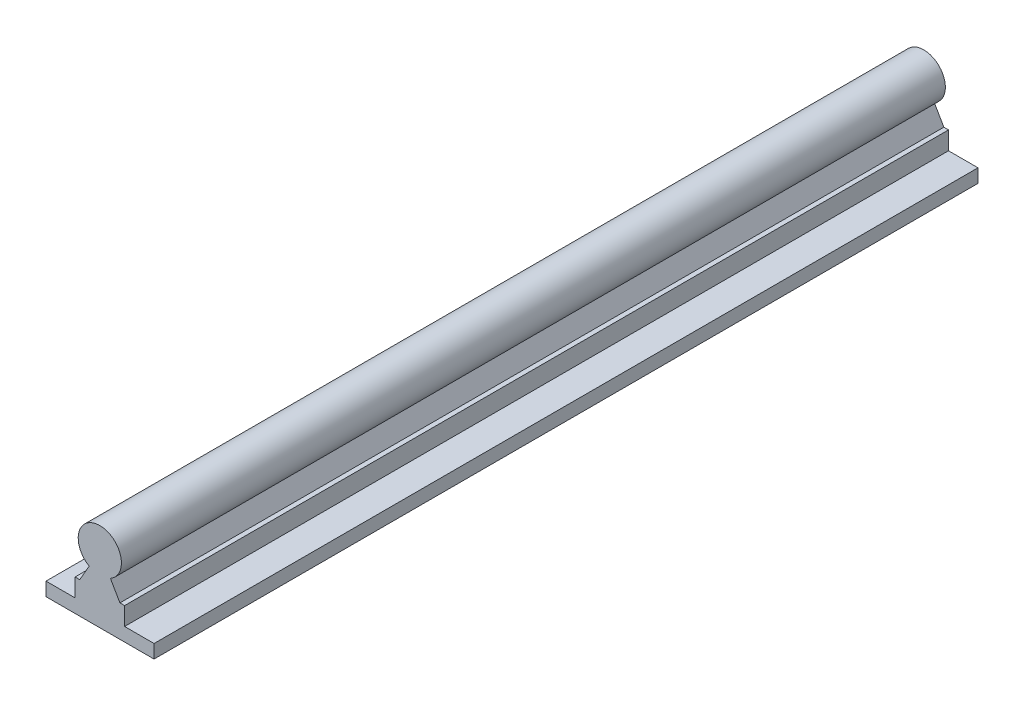
ISO-10303-21;
HEADER;
FILE_DESCRIPTION(('STEP AP214'),'2;1');
FILE_NAME('part.step','',(''),(''),'','','');
FILE_SCHEMA(('AUTOMOTIVE_DESIGN { 1 0 10303 214 1 1 1 1 }'));
ENDSEC;
DATA;
#1=APPLICATION_CONTEXT('core data for automotive mechanical design processes');
#2=APPLICATION_PROTOCOL_DEFINITION('international standard','automotive_design',2000,#1);
#3=PRODUCT_CONTEXT('',#1,'mechanical');
#4=PRODUCT('Part','Part','',(#3));
#5=PRODUCT_RELATED_PRODUCT_CATEGORY('part','',(#4));
#6=PRODUCT_DEFINITION_FORMATION('','',#4);
#7=PRODUCT_DEFINITION_CONTEXT('part definition',#1,'design');
#8=PRODUCT_DEFINITION('design','',#6,#7);
#9=PRODUCT_DEFINITION_SHAPE('','',#8);
#10=(LENGTH_UNIT() NAMED_UNIT(*) SI_UNIT(.MILLI.,.METRE.));
#11=(NAMED_UNIT(*) PLANE_ANGLE_UNIT() SI_UNIT($,.RADIAN.));
#12=(NAMED_UNIT(*) SI_UNIT($,.STERADIAN.) SOLID_ANGLE_UNIT());
#13=UNCERTAINTY_MEASURE_WITH_UNIT(LENGTH_MEASURE(1.E-05),#10,'distance_accuracy_value','');
#14=(GEOMETRIC_REPRESENTATION_CONTEXT(3) GLOBAL_UNCERTAINTY_ASSIGNED_CONTEXT((#13)) GLOBAL_UNIT_ASSIGNED_CONTEXT((#10,
#11,#12)) REPRESENTATION_CONTEXT('',''));
#15=CARTESIAN_POINT('',(0.,0.,0.));
#16=DIRECTION('',(0.,0.,1.));
#17=DIRECTION('',(1.,0.,0.));
#18=AXIS2_PLACEMENT_3D('',#15,#16,#17);
#19=CARTESIAN_POINT('',(-25.9312656727246,-7.76101992966002,305.));
#20=DIRECTION('',(-1.,0.,0.));
#21=DIRECTION('',(0.,0.,1.));
#22=AXIS2_PLACEMENT_3D('',#19,#20,#21);
#23=PLANE('',#22);
#24=DIRECTION('',(0.,1.,0.));
#25=VECTOR('',#24,1.);
#26=CARTESIAN_POINT('',(-25.9312656727246,-7.76101992966002,0.));
#27=LINE('',#26,#25);
#28=CARTESIAN_POINT('',(-25.9312656727246,-7.76101992966002,0.));
#29=VERTEX_POINT('',#28);
#30=CARTESIAN_POINT('',(-25.9312656727246,-2.76101992966003,0.));
#31=VERTEX_POINT('',#30);
#32=EDGE_CURVE('E153',#29,#31,#27,.T.);
#33=ORIENTED_EDGE('',*,*,#32,.F.);
#34=DIRECTION('',(0.,0.,-1.));
#35=VECTOR('',#34,1.);
#36=CARTESIAN_POINT('',(-25.9312656727246,-7.76101992966002,305.));
#37=LINE('',#36,#35);
#38=CARTESIAN_POINT('',(-25.9312656727246,-7.76101992966002,305.));
#39=VERTEX_POINT('',#38);
#40=EDGE_CURVE('E11',#39,#29,#37,.T.);
#41=ORIENTED_EDGE('',*,*,#40,.F.);
#42=DIRECTION('',(0.,1.,0.));
#43=VECTOR('',#42,1.);
#44=CARTESIAN_POINT('',(-25.9312656727246,-7.76101992966002,305.));
#45=LINE('',#44,#43);
#46=CARTESIAN_POINT('',(-25.9312656727246,-2.76101992966003,305.));
#47=VERTEX_POINT('',#46);
#48=EDGE_CURVE('E185',#39,#47,#45,.T.);
#49=ORIENTED_EDGE('',*,*,#48,.T.);
#50=DIRECTION('',(0.,0.,-1.));
#51=VECTOR('',#50,1.);
#52=CARTESIAN_POINT('',(-25.9312656727246,-2.76101992966003,305.));
#53=LINE('',#52,#51);
#54=EDGE_CURVE('E35',#47,#31,#53,.T.);
#55=ORIENTED_EDGE('',*,*,#54,.T.);
#56=EDGE_LOOP('',(#33,#41,#49,#55));
#57=FACE_BOUND('',#56,.T.);
#58=ADVANCED_FACE('F32',(#57),#23,.T.);
#59=CARTESIAN_POINT('',(14.0687343272754,-7.76101992966002,305.));
#60=DIRECTION('',(0.,-1.,0.));
#61=DIRECTION('',(0.,0.,-1.));
#62=AXIS2_PLACEMENT_3D('',#59,#60,#61);
#63=PLANE('',#62);
#64=DIRECTION('',(-1.,0.,0.));
#65=VECTOR('',#64,1.);
#66=CARTESIAN_POINT('',(14.0687343272754,-7.76101992966002,0.));
#67=LINE('',#66,#65);
#68=CARTESIAN_POINT('',(14.0687343272754,-7.76101992966002,0.));
#69=VERTEX_POINT('',#68);
#70=EDGE_CURVE('E183',#69,#29,#67,.T.);
#71=ORIENTED_EDGE('',*,*,#70,.F.);
#72=DIRECTION('',(0.,0.,-1.));
#73=VECTOR('',#72,1.);
#74=CARTESIAN_POINT('',(14.0687343272754,-7.76101992966002,305.));
#75=LINE('',#74,#73);
#76=CARTESIAN_POINT('',(14.0687343272754,-7.76101992966002,305.));
#77=VERTEX_POINT('',#76);
#78=EDGE_CURVE('E41',#77,#69,#75,.T.);
#79=ORIENTED_EDGE('',*,*,#78,.F.);
#80=DIRECTION('',(-1.,0.,0.));
#81=VECTOR('',#80,1.);
#82=CARTESIAN_POINT('',(14.0687343272754,-7.76101992966002,305.));
#83=LINE('',#82,#81);
#84=EDGE_CURVE('E143',#77,#39,#83,.T.);
#85=ORIENTED_EDGE('',*,*,#84,.T.);
#86=ORIENTED_EDGE('',*,*,#40,.T.);
#87=EDGE_LOOP('',(#71,#79,#85,#86));
#88=FACE_BOUND('',#87,.T.);
#89=ADVANCED_FACE('F205',(#88),#63,.T.);
#90=CARTESIAN_POINT('',(14.0687343272754,-2.76101992966002,305.));
#91=DIRECTION('',(1.,0.,0.));
#92=DIRECTION('',(0.,0.,-1.));
#93=AXIS2_PLACEMENT_3D('',#90,#91,#92);
#94=PLANE('',#93);
#95=DIRECTION('',(0.,-1.,0.));
#96=VECTOR('',#95,1.);
#97=CARTESIAN_POINT('',(14.0687343272754,-2.76101992966002,0.));
#98=LINE('',#97,#96);
#99=CARTESIAN_POINT('',(14.0687343272754,-2.76101992966002,0.));
#100=VERTEX_POINT('',#99);
#101=EDGE_CURVE('E130',#100,#69,#98,.T.);
#102=ORIENTED_EDGE('',*,*,#101,.F.);
#103=DIRECTION('',(0.,0.,-1.));
#104=VECTOR('',#103,1.);
#105=CARTESIAN_POINT('',(14.0687343272754,-2.76101992966002,305.));
#106=LINE('',#105,#104);
#107=CARTESIAN_POINT('',(14.0687343272754,-2.76101992966002,305.));
#108=VERTEX_POINT('',#107);
#109=EDGE_CURVE('E125',#108,#100,#106,.T.);
#110=ORIENTED_EDGE('',*,*,#109,.F.);
#111=DIRECTION('',(0.,-1.,0.));
#112=VECTOR('',#111,1.);
#113=CARTESIAN_POINT('',(14.0687343272754,-2.76101992966002,305.));
#114=LINE('',#113,#112);
#115=EDGE_CURVE('E128',#108,#77,#114,.T.);
#116=ORIENTED_EDGE('',*,*,#115,.T.);
#117=ORIENTED_EDGE('',*,*,#78,.T.);
#118=EDGE_LOOP('',(#102,#110,#116,#117));
#119=FACE_BOUND('',#118,.T.);
#120=ADVANCED_FACE('F127',(#119),#94,.T.);
#121=CARTESIAN_POINT('',(3.16040300380469,-2.76101992966,305.));
#122=DIRECTION('',(0.,1.,0.));
#123=DIRECTION('',(-1.,0.,0.));
#124=AXIS2_PLACEMENT_3D('',#121,#122,#123);
#125=PLANE('',#124);
#126=DIRECTION('',(1.,0.,0.));
#127=VECTOR('',#126,1.);
#128=CARTESIAN_POINT('',(3.16040300380469,-2.76101992966,0.));
#129=LINE('',#128,#127);
#130=CARTESIAN_POINT('',(3.16040300380469,-2.76101992966,0.));
#131=VERTEX_POINT('',#130);
#132=EDGE_CURVE('E180',#131,#100,#129,.T.);
#133=ORIENTED_EDGE('',*,*,#132,.F.);
#134=DIRECTION('',(0.,0.,-1.));
#135=VECTOR('',#134,1.);
#136=CARTESIAN_POINT('',(3.16040300380469,-2.76101992966,305.));
#137=LINE('',#136,#135);
#138=CARTESIAN_POINT('',(3.16040300380469,-2.76101992966,305.));
#139=VERTEX_POINT('',#138);
#140=EDGE_CURVE('E135',#139,#131,#137,.T.);
#141=ORIENTED_EDGE('',*,*,#140,.F.);
#142=DIRECTION('',(1.,0.,0.));
#143=VECTOR('',#142,1.);
#144=CARTESIAN_POINT('',(3.16040300380469,-2.76101992966,305.));
#145=LINE('',#144,#143);
#146=EDGE_CURVE('E141',#139,#108,#145,.T.);
#147=ORIENTED_EDGE('',*,*,#146,.T.);
#148=ORIENTED_EDGE('',*,*,#109,.T.);
#149=EDGE_LOOP('',(#133,#141,#147,#148));
#150=FACE_BOUND('',#149,.T.);
#151=ADVANCED_FACE('F145',(#150),#125,.T.);
#152=CARTESIAN_POINT('',(3.16040300380469,3.93898007033999,305.));
#153=DIRECTION('',(1.,0.,0.));
#154=DIRECTION('',(0.,1.,0.));
#155=AXIS2_PLACEMENT_3D('',#152,#153,#154);
#156=PLANE('',#155);
#157=DIRECTION('',(0.,-1.,0.));
#158=VECTOR('',#157,1.);
#159=CARTESIAN_POINT('',(3.16040300380469,3.93898007033999,0.));
#160=LINE('',#159,#158);
#161=CARTESIAN_POINT('',(3.16040300380469,3.93898007033999,0.));
#162=VERTEX_POINT('',#161);
#163=EDGE_CURVE('E177',#162,#131,#160,.T.);
#164=ORIENTED_EDGE('',*,*,#163,.F.);
#165=DIRECTION('',(0.,0.,-1.));
#166=VECTOR('',#165,1.);
#167=CARTESIAN_POINT('',(3.16040300380469,3.93898007033999,305.));
#168=LINE('',#167,#166);
#169=CARTESIAN_POINT('',(3.16040300380469,3.93898007033999,305.));
#170=VERTEX_POINT('',#169);
#171=EDGE_CURVE('E189',#170,#162,#168,.T.);
#172=ORIENTED_EDGE('',*,*,#171,.F.);
#173=DIRECTION('',(0.,-1.,0.));
#174=VECTOR('',#173,1.);
#175=CARTESIAN_POINT('',(3.16040300380469,3.93898007033999,305.));
#176=LINE('',#175,#174);
#177=EDGE_CURVE('E146',#170,#139,#176,.T.);
#178=ORIENTED_EDGE('',*,*,#177,.T.);
#179=ORIENTED_EDGE('',*,*,#140,.T.);
#180=EDGE_LOOP('',(#164,#172,#178,#179));
#181=FACE_BOUND('',#180,.T.);
#182=ADVANCED_FACE('F218',(#181),#156,.T.);
#183=CARTESIAN_POINT('',(1.43223964586137,3.93898007033999,305.));
#184=DIRECTION('',(0.,1.,0.));
#185=DIRECTION('',(0.,0.,1.));
#186=AXIS2_PLACEMENT_3D('',#183,#184,#185);
#187=PLANE('',#186);
#188=DIRECTION('',(1.,0.,0.));
#189=VECTOR('',#188,1.);
#190=CARTESIAN_POINT('',(1.43223964586137,3.93898007033999,0.));
#191=LINE('',#190,#189);
#192=CARTESIAN_POINT('',(1.43223964586137,3.93898007033999,0.));
#193=VERTEX_POINT('',#192);
#194=EDGE_CURVE('E174',#193,#162,#191,.T.);
#195=ORIENTED_EDGE('',*,*,#194,.F.);
#196=DIRECTION('',(0.,0.,-1.));
#197=VECTOR('',#196,1.);
#198=CARTESIAN_POINT('',(1.43223964586137,3.93898007033999,305.));
#199=LINE('',#198,#197);
#200=CARTESIAN_POINT('',(1.43223964586137,3.93898007033999,305.));
#201=VERTEX_POINT('',#200);
#202=EDGE_CURVE('E191',#201,#193,#199,.T.);
#203=ORIENTED_EDGE('',*,*,#202,.F.);
#204=DIRECTION('',(1.,0.,0.));
#205=VECTOR('',#204,1.);
#206=CARTESIAN_POINT('',(1.43223964586137,3.93898007033999,305.));
#207=LINE('',#206,#205);
#208=EDGE_CURVE('E148',#201,#170,#207,.T.);
#209=ORIENTED_EDGE('',*,*,#208,.T.);
#210=ORIENTED_EDGE('',*,*,#171,.T.);
#211=EDGE_LOOP('',(#195,#203,#209,#210));
#212=FACE_BOUND('',#211,.T.);
#213=ADVANCED_FACE('F221',(#212),#187,.T.);
#214=CARTESIAN_POINT('',(-2.08959699619534,10.03898007034,305.));
#215=DIRECTION('',(0.866025403784439,0.5,0.));
#216=DIRECTION('',(-0.5,0.866025403784439,0.));
#217=AXIS2_PLACEMENT_3D('',#214,#215,#216);
#218=PLANE('',#217);
#219=DIRECTION('',(0.5,-0.866025403784439,0.));
#220=VECTOR('',#219,1.);
#221=CARTESIAN_POINT('',(-2.08959699619534,10.03898007034,0.));
#222=LINE('',#221,#220);
#223=CARTESIAN_POINT('',(-2.08959699619534,10.03898007034,0.));
#224=VERTEX_POINT('',#223);
#225=EDGE_CURVE('E171',#224,#193,#222,.T.);
#226=ORIENTED_EDGE('',*,*,#225,.F.);
#227=DIRECTION('',(0.,0.,-1.));
#228=VECTOR('',#227,1.);
#229=CARTESIAN_POINT('',(-2.08959699619534,10.03898007034,305.));
#230=LINE('',#229,#228);
#231=CARTESIAN_POINT('',(-2.08959699619534,10.03898007034,305.));
#232=VERTEX_POINT('',#231);
#233=EDGE_CURVE('E193',#232,#224,#230,.T.);
#234=ORIENTED_EDGE('',*,*,#233,.F.);
#235=DIRECTION('',(0.5,-0.866025403784439,0.));
#236=VECTOR('',#235,1.);
#237=CARTESIAN_POINT('',(-2.08959699619534,10.03898007034,305.));
#238=LINE('',#237,#236);
#239=EDGE_CURVE('E347',#232,#201,#238,.T.);
#240=ORIENTED_EDGE('',*,*,#239,.T.);
#241=ORIENTED_EDGE('',*,*,#202,.T.);
#242=EDGE_LOOP('',(#226,#234,#240,#241));
#243=FACE_BOUND('',#242,.T.);
#244=ADVANCED_FACE('F225',(#243),#218,.T.);
#245=CARTESIAN_POINT('',(-6.01043133445998,17.012290481607,305.));
#246=DIRECTION('',(0.,0.,-1.));
#247=DIRECTION('',(-1.,0.,0.));
#248=AXIS2_PLACEMENT_3D('',#245,#246,#247);
#249=CYLINDRICAL_SURFACE('',#248,8.);
#250=CARTESIAN_POINT('',(-6.01043133445998,17.012290481607,0.));
#251=DIRECTION('',(0.,0.,-1.));
#252=DIRECTION('',(-1.,0.,0.));
#253=AXIS2_PLACEMENT_3D('',#250,#251,#252);
#254=CIRCLE('',#253,8.);
#255=CARTESIAN_POINT('',(-9.93126567272462,10.03898007034,0.));
#256=VERTEX_POINT('',#255);
#257=EDGE_CURVE('E168',#256,#224,#254,.T.);
#258=ORIENTED_EDGE('',*,*,#257,.F.);
#259=DIRECTION('',(0.,0.,-1.));
#260=VECTOR('',#259,1.);
#261=CARTESIAN_POINT('',(-9.93126567272462,10.03898007034,305.));
#262=LINE('',#261,#260);
#263=CARTESIAN_POINT('',(-9.93126567272462,10.03898007034,305.));
#264=VERTEX_POINT('',#263);
#265=EDGE_CURVE('E195',#264,#256,#262,.T.);
#266=ORIENTED_EDGE('',*,*,#265,.F.);
#267=CARTESIAN_POINT('',(-6.01043133445998,17.012290481607,305.));
#268=DIRECTION('',(0.,0.,-1.));
#269=DIRECTION('',(-1.,0.,0.));
#270=AXIS2_PLACEMENT_3D('',#267,#268,#269);
#271=CIRCLE('',#270,8.);
#272=EDGE_CURVE('E351',#264,#232,#271,.T.);
#273=ORIENTED_EDGE('',*,*,#272,.T.);
#274=ORIENTED_EDGE('',*,*,#233,.T.);
#275=EDGE_LOOP('',(#258,#266,#273,#274));
#276=FACE_BOUND('',#275,.T.);
#277=ADVANCED_FACE('F229',(#276),#249,.T.);
#278=CARTESIAN_POINT('',(-13.4531023147813,3.93898007033998,305.));
#279=DIRECTION('',(-0.86602540378444,0.499999999999998,0.));
#280=DIRECTION('',(-0.499999999999998,-0.86602540378444,0.));
#281=AXIS2_PLACEMENT_3D('',#278,#279,#280);
#282=PLANE('',#281);
#283=DIRECTION('',(0.499999999999998,0.86602540378444,0.));
#284=VECTOR('',#283,1.);
#285=CARTESIAN_POINT('',(-13.4531023147813,3.93898007033998,0.));
#286=LINE('',#285,#284);
#287=CARTESIAN_POINT('',(-13.4531023147813,3.93898007033998,0.));
#288=VERTEX_POINT('',#287);
#289=EDGE_CURVE('E165',#288,#256,#286,.T.);
#290=ORIENTED_EDGE('',*,*,#289,.F.);
#291=DIRECTION('',(0.,0.,-1.));
#292=VECTOR('',#291,1.);
#293=CARTESIAN_POINT('',(-13.4531023147813,3.93898007033998,305.));
#294=LINE('',#293,#292);
#295=CARTESIAN_POINT('',(-13.4531023147813,3.93898007033998,305.));
#296=VERTEX_POINT('',#295);
#297=EDGE_CURVE('E197',#296,#288,#294,.T.);
#298=ORIENTED_EDGE('',*,*,#297,.F.);
#299=DIRECTION('',(0.499999999999998,0.86602540378444,0.));
#300=VECTOR('',#299,1.);
#301=CARTESIAN_POINT('',(-13.4531023147813,3.93898007033998,305.));
#302=LINE('',#301,#300);
#303=EDGE_CURVE('E340',#296,#264,#302,.T.);
#304=ORIENTED_EDGE('',*,*,#303,.T.);
#305=ORIENTED_EDGE('',*,*,#265,.T.);
#306=EDGE_LOOP('',(#290,#298,#304,#305));
#307=FACE_BOUND('',#306,.T.);
#308=ADVANCED_FACE('F233',(#307),#282,.T.);
#309=CARTESIAN_POINT('',(-15.1812656727246,3.93898007033998,305.));
#310=DIRECTION('',(0.,1.,0.));
#311=DIRECTION('',(-1.,0.,0.));
#312=AXIS2_PLACEMENT_3D('',#309,#310,#311);
#313=PLANE('',#312);
#314=DIRECTION('',(1.,0.,0.));
#315=VECTOR('',#314,1.);
#316=CARTESIAN_POINT('',(-15.1812656727246,3.93898007033998,0.));
#317=LINE('',#316,#315);
#318=CARTESIAN_POINT('',(-15.1812656727246,3.93898007033998,0.));
#319=VERTEX_POINT('',#318);
#320=EDGE_CURVE('E162',#319,#288,#317,.T.);
#321=ORIENTED_EDGE('',*,*,#320,.F.);
#322=DIRECTION('',(0.,0.,-1.));
#323=VECTOR('',#322,1.);
#324=CARTESIAN_POINT('',(-15.1812656727246,3.93898007033998,305.));
#325=LINE('',#324,#323);
#326=CARTESIAN_POINT('',(-15.1812656727246,3.93898007033998,305.));
#327=VERTEX_POINT('',#326);
#328=EDGE_CURVE('E199',#327,#319,#325,.T.);
#329=ORIENTED_EDGE('',*,*,#328,.F.);
#330=DIRECTION('',(1.,0.,0.));
#331=VECTOR('',#330,1.);
#332=CARTESIAN_POINT('',(-15.1812656727246,3.93898007033998,305.));
#333=LINE('',#332,#331);
#334=EDGE_CURVE('E336',#327,#296,#333,.T.);
#335=ORIENTED_EDGE('',*,*,#334,.T.);
#336=ORIENTED_EDGE('',*,*,#297,.T.);
#337=EDGE_LOOP('',(#321,#329,#335,#336));
#338=FACE_BOUND('',#337,.T.);
#339=ADVANCED_FACE('F237',(#338),#313,.T.);
#340=CARTESIAN_POINT('',(-15.1812656727246,-2.76101992966002,305.));
#341=DIRECTION('',(-1.,0.,0.));
#342=DIRECTION('',(0.,0.,1.));
#343=AXIS2_PLACEMENT_3D('',#340,#341,#342);
#344=PLANE('',#343);
#345=DIRECTION('',(0.,1.,0.));
#346=VECTOR('',#345,1.);
#347=CARTESIAN_POINT('',(-15.1812656727246,-2.76101992966002,0.));
#348=LINE('',#347,#346);
#349=CARTESIAN_POINT('',(-15.1812656727246,-2.76101992966002,0.));
#350=VERTEX_POINT('',#349);
#351=EDGE_CURVE('E159',#350,#319,#348,.T.);
#352=ORIENTED_EDGE('',*,*,#351,.F.);
#353=DIRECTION('',(0.,0.,-1.));
#354=VECTOR('',#353,1.);
#355=CARTESIAN_POINT('',(-15.1812656727246,-2.76101992966002,305.));
#356=LINE('',#355,#354);
#357=CARTESIAN_POINT('',(-15.1812656727246,-2.76101992966002,305.));
#358=VERTEX_POINT('',#357);
#359=EDGE_CURVE('E200',#358,#350,#356,.T.);
#360=ORIENTED_EDGE('',*,*,#359,.F.);
#361=DIRECTION('',(0.,1.,0.));
#362=VECTOR('',#361,1.);
#363=CARTESIAN_POINT('',(-15.1812656727246,-2.76101992966002,305.));
#364=LINE('',#363,#362);
#365=EDGE_CURVE('E357',#358,#327,#364,.T.);
#366=ORIENTED_EDGE('',*,*,#365,.T.);
#367=ORIENTED_EDGE('',*,*,#328,.T.);
#368=EDGE_LOOP('',(#352,#360,#366,#367));
#369=FACE_BOUND('',#368,.T.);
#370=ADVANCED_FACE('F241',(#369),#344,.T.);
#371=CARTESIAN_POINT('',(-25.9312656727246,-2.76101992966003,305.));
#372=DIRECTION('',(0.,1.,0.));
#373=DIRECTION('',(-1.,0.,0.));
#374=AXIS2_PLACEMENT_3D('',#371,#372,#373);
#375=PLANE('',#374);
#376=DIRECTION('',(1.,0.,0.));
#377=VECTOR('',#376,1.);
#378=CARTESIAN_POINT('',(-25.9312656727246,-2.76101992966003,0.));
#379=LINE('',#378,#377);
#380=EDGE_CURVE('E156',#31,#350,#379,.T.);
#381=ORIENTED_EDGE('',*,*,#380,.F.);
#382=ORIENTED_EDGE('',*,*,#54,.F.);
#383=DIRECTION('',(1.,0.,0.));
#384=VECTOR('',#383,1.);
#385=CARTESIAN_POINT('',(-25.9312656727246,-2.76101992966003,305.));
#386=LINE('',#385,#384);
#387=EDGE_CURVE('E359',#47,#358,#386,.T.);
#388=ORIENTED_EDGE('',*,*,#387,.T.);
#389=ORIENTED_EDGE('',*,*,#359,.T.);
#390=EDGE_LOOP('',(#381,#382,#388,#389));
#391=FACE_BOUND('',#390,.T.);
#392=ADVANCED_FACE('F202',(#391),#375,.T.);
#393=CARTESIAN_POINT('',(-6.01043133445998,17.012290481607,305.));
#394=DIRECTION('',(0.,0.,-1.));
#395=DIRECTION('',(-1.,0.,0.));
#396=AXIS2_PLACEMENT_3D('',#393,#394,#395);
#397=PLANE('',#396);
#398=ORIENTED_EDGE('',*,*,#48,.F.);
#399=ORIENTED_EDGE('',*,*,#84,.F.);
#400=ORIENTED_EDGE('',*,*,#115,.F.);
#401=ORIENTED_EDGE('',*,*,#146,.F.);
#402=ORIENTED_EDGE('',*,*,#177,.F.);
#403=ORIENTED_EDGE('',*,*,#208,.F.);
#404=ORIENTED_EDGE('',*,*,#239,.F.);
#405=ORIENTED_EDGE('',*,*,#272,.F.);
#406=ORIENTED_EDGE('',*,*,#303,.F.);
#407=ORIENTED_EDGE('',*,*,#334,.F.);
#408=ORIENTED_EDGE('',*,*,#365,.F.);
#409=ORIENTED_EDGE('',*,*,#387,.F.);
#410=EDGE_LOOP('',(#398,#399,#400,#401,#402,#403,#404,#405,#406,#407,#408,#409));
#411=FACE_BOUND('',#410,.T.);
#412=ADVANCED_FACE('F139',(#411),#397,.F.);
#413=CARTESIAN_POINT('',(-6.01043133445998,17.012290481607,0.));
#414=DIRECTION('',(0.,0.,-1.));
#415=DIRECTION('',(-1.,0.,0.));
#416=AXIS2_PLACEMENT_3D('',#413,#414,#415);
#417=PLANE('',#416);
#418=ORIENTED_EDGE('',*,*,#32,.T.);
#419=ORIENTED_EDGE('',*,*,#380,.T.);
#420=ORIENTED_EDGE('',*,*,#351,.T.);
#421=ORIENTED_EDGE('',*,*,#320,.T.);
#422=ORIENTED_EDGE('',*,*,#289,.T.);
#423=ORIENTED_EDGE('',*,*,#257,.T.);
#424=ORIENTED_EDGE('',*,*,#225,.T.);
#425=ORIENTED_EDGE('',*,*,#194,.T.);
#426=ORIENTED_EDGE('',*,*,#163,.T.);
#427=ORIENTED_EDGE('',*,*,#132,.T.);
#428=ORIENTED_EDGE('',*,*,#101,.T.);
#429=ORIENTED_EDGE('',*,*,#70,.T.);
#430=EDGE_LOOP('',(#418,#419,#420,#421,#422,#423,#424,#425,#426,#427,#428,#429));
#431=FACE_BOUND('',#430,.T.);
#432=ADVANCED_FACE('F204',(#431),#417,.T.);
#433=CLOSED_SHELL('',(#58,#89,#120,#151,#182,#213,#244,#277,#308,#339,#370,#392,#412,#432));
#434=MANIFOLD_SOLID_BREP('B2',#433);
#435=ADVANCED_BREP_SHAPE_REPRESENTATION('',(#18,#434),#14);
#436=SHAPE_DEFINITION_REPRESENTATION(#9,#435);
ENDSEC;
END-ISO-10303-21;
